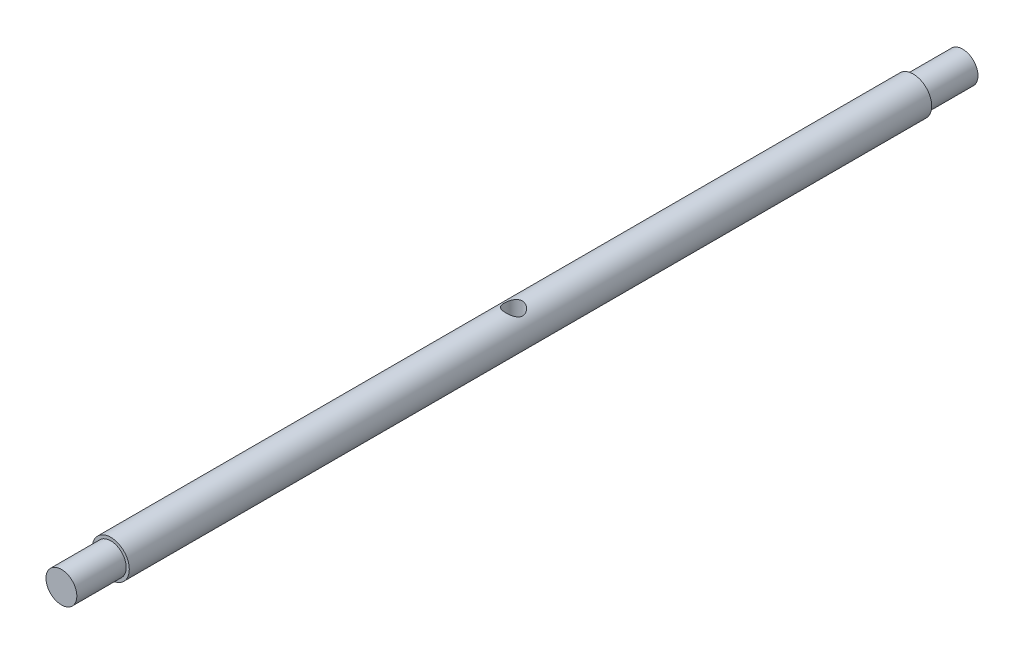
ISO-10303-21;
HEADER;
FILE_DESCRIPTION(('STEP AP214'),'2;1');
FILE_NAME('part.step','',(''),(''),'','','');
FILE_SCHEMA(('AUTOMOTIVE_DESIGN { 1 0 10303 214 1 1 1 1 }'));
ENDSEC;
DATA;
#1=APPLICATION_CONTEXT('core data for automotive mechanical design processes');
#2=APPLICATION_PROTOCOL_DEFINITION('international standard','automotive_design',2000,#1);
#3=PRODUCT_CONTEXT('',#1,'mechanical');
#4=PRODUCT('Part','Part','',(#3));
#5=PRODUCT_RELATED_PRODUCT_CATEGORY('part','',(#4));
#6=PRODUCT_DEFINITION_FORMATION('','',#4);
#7=PRODUCT_DEFINITION_CONTEXT('part definition',#1,'design');
#8=PRODUCT_DEFINITION('design','',#6,#7);
#9=PRODUCT_DEFINITION_SHAPE('','',#8);
#10=(LENGTH_UNIT() NAMED_UNIT(*) SI_UNIT(.MILLI.,.METRE.));
#11=(NAMED_UNIT(*) PLANE_ANGLE_UNIT() SI_UNIT($,.RADIAN.));
#12=(NAMED_UNIT(*) SI_UNIT($,.STERADIAN.) SOLID_ANGLE_UNIT());
#13=UNCERTAINTY_MEASURE_WITH_UNIT(LENGTH_MEASURE(1.E-05),#10,'distance_accuracy_value','');
#14=(GEOMETRIC_REPRESENTATION_CONTEXT(3) GLOBAL_UNCERTAINTY_ASSIGNED_CONTEXT((#13)) GLOBAL_UNIT_ASSIGNED_CONTEXT((#10,
#11,#12)) REPRESENTATION_CONTEXT('',''));
#15=CARTESIAN_POINT('',(0.,0.,0.));
#16=DIRECTION('',(0.,0.,1.));
#17=DIRECTION('',(1.,0.,0.));
#18=AXIS2_PLACEMENT_3D('',#15,#16,#17);
#19=CARTESIAN_POINT('',(0.,0.,130.));
#20=DIRECTION('',(0.,0.,-1.));
#21=DIRECTION('',(-1.,0.,0.));
#22=AXIS2_PLACEMENT_3D('',#19,#20,#21);
#23=CYLINDRICAL_SURFACE('',#22,3.);
#24=CARTESIAN_POINT('',(0.25,-2.98956518577535,66.5));
#25=CARTESIAN_POINT('',(0.17269642141614,-2.99602553013006,66.4999952113587));
#26=CARTESIAN_POINT('',(0.0950608738628822,-2.99947183506212,66.4939911977629));
#27=CARTESIAN_POINT('',(-0.0584400000249379,-3.00041641133484,66.4700060739507));
#28=CARTESIAN_POINT('',(-0.134302599700459,-2.99790606090529,66.4520076298905));
#29=CARTESIAN_POINT('',(-0.281790664814006,-2.98764875279408,66.4046990716207));
#30=CARTESIAN_POINT('',(-0.35342724917192,-2.9799162704619,66.37542032166));
#31=CARTESIAN_POINT('',(-0.49089667125681,-2.96037977583642,66.3065180067073));
#32=CARTESIAN_POINT('',(-0.556729410100019,-2.94857569418956,66.2668942655069));
#33=CARTESIAN_POINT('',(-0.68390290566241,-2.92175981715249,66.1765070165311));
#34=CARTESIAN_POINT('',(-0.744932006141061,-2.90663261458157,66.1253402270932));
#35=CARTESIAN_POINT('',(-0.858035984268782,-2.8752782830735,66.0141750538369));
#36=CARTESIAN_POINT('',(-0.910106018343036,-2.85905056572865,65.9541719251226));
#37=CARTESIAN_POINT('',(-1.00783823474594,-2.82614993688294,65.8216608362764));
#38=CARTESIAN_POINT('',(-1.05270403709698,-2.80953814266997,65.7485470746806));
#39=CARTESIAN_POINT('',(-1.12952233663047,-2.77954837023804,65.5952020399382));
#40=CARTESIAN_POINT('',(-1.16147822464401,-2.76616954324119,65.5149726424969));
#41=CARTESIAN_POINT('',(-1.21068231642024,-2.74498771769881,65.3514557226514));
#42=CARTESIAN_POINT('',(-1.22825565630192,-2.73706214215833,65.2682829052235));
#43=CARTESIAN_POINT('',(-1.24907437267902,-2.7276277771573,65.0998283727901));
#44=CARTESIAN_POINT('',(-1.25232969875111,-2.72611453180026,65.0145481636632));
#45=CARTESIAN_POINT('',(-1.2447045977589,-2.72960005759235,64.8519083751222));
#46=CARTESIAN_POINT('',(-1.23497697349754,-2.73406785294911,64.7744797801816));
#47=CARTESIAN_POINT('',(-1.20378978270818,-2.74794060264144,64.622486262657));
#48=CARTESIAN_POINT('',(-1.18232772499008,-2.75734660532886,64.5479219517519));
#49=CARTESIAN_POINT('',(-1.12815486514093,-2.77995148574605,64.4027028080583));
#50=CARTESIAN_POINT('',(-1.09532481225703,-2.79319031849184,64.3320990318549));
#51=CARTESIAN_POINT('',(-1.01939794960569,-2.82178498312674,64.1971104043154));
#52=CARTESIAN_POINT('',(-0.976296911856051,-2.83714168572323,64.1327281293993));
#53=CARTESIAN_POINT('',(-0.876645912761245,-2.86957547362445,64.0061689998989));
#54=CARTESIAN_POINT('',(-0.819257803193822,-2.8866868853803,63.9446586786066));
#55=CARTESIAN_POINT('',(-0.694725375416323,-2.91915973110964,63.8318594221669));
#56=CARTESIAN_POINT('',(-0.627579181744112,-2.9345208276652,63.7805724564089));
#57=CARTESIAN_POINT('',(-0.484002949245948,-2.96161231613355,63.6890512104587));
#58=CARTESIAN_POINT('',(-0.407452021459474,-2.97328661594214,63.6489886455506));
#59=CARTESIAN_POINT('',(-0.248041133960005,-2.99079996604019,63.5824674072718));
#60=CARTESIAN_POINT('',(-0.165185983640129,-2.9966434174961,63.5559984806601));
#61=CARTESIAN_POINT('',(-0.00277248739778299,-3.00100907113582,63.5192999209167));
#62=CARTESIAN_POINT('',(0.0765154336064436,-3.00008206449229,63.5079358686385));
#63=CARTESIAN_POINT('',(0.235543527844696,-2.99179737422256,63.4979568907608));
#64=CARTESIAN_POINT('',(0.315283582667204,-2.9844413034606,63.4993387684109));
#65=CARTESIAN_POINT('',(0.468809965625171,-2.96410572172022,63.5141405994697));
#66=CARTESIAN_POINT('',(0.542695567092175,-2.9514227687626,63.5269609495946));
#67=CARTESIAN_POINT('',(0.686813726089401,-2.92125182634506,63.5630878149209));
#68=CARTESIAN_POINT('',(0.757045549245624,-2.90376287532967,63.5863964291472));
#69=CARTESIAN_POINT('',(0.896335445624111,-2.86393578112953,63.6441757942527));
#70=CARTESIAN_POINT('',(0.965095372126569,-2.84137710821006,63.6792098821918));
#71=CARTESIAN_POINT('',(1.09580389853578,-2.79357579351915,63.7588390109646));
#72=CARTESIAN_POINT('',(1.15774910097523,-2.76833182522364,63.8034387883658));
#73=CARTESIAN_POINT('',(1.28073937979295,-2.71380534340435,63.9069453045832));
#74=CARTESIAN_POINT('',(1.34083682600192,-2.68439520112318,63.966914002283));
#75=CARTESIAN_POINT('',(1.45039802141764,-2.62682010616241,64.0965316127875));
#76=CARTESIAN_POINT('',(1.49985070609687,-2.59865647306368,64.1661904752879));
#77=CARTESIAN_POINT('',(1.58865105160203,-2.54538491275337,64.3173425485545));
#78=CARTESIAN_POINT('',(1.62746875980633,-2.52046198169207,64.3992174575315));
#79=CARTESIAN_POINT('',(1.69004794562851,-2.47894626080137,64.5704428848147));
#80=CARTESIAN_POINT('',(1.71384470769536,-2.46233396835001,64.6597753216171));
#81=CARTESIAN_POINT('',(1.74235772318642,-2.44222225416342,64.8292944683731));
#82=CARTESIAN_POINT('',(1.74935466727668,-2.43716097073707,64.9089091849373));
#83=CARTESIAN_POINT('',(1.7505585690523,-2.43629851234424,65.0682744895491));
#84=CARTESIAN_POINT('',(1.74477159394934,-2.44049294464035,65.1480249952013));
#85=CARTESIAN_POINT('',(1.72245945671945,-2.45627310709654,65.2942914902519));
#86=CARTESIAN_POINT('',(1.70745098558705,-2.46681119822039,65.3611658702209));
#87=CARTESIAN_POINT('',(1.66887874739995,-2.49306758410284,65.4913171316343));
#88=CARTESIAN_POINT('',(1.64531201334897,-2.5087876751933,65.5545927566452));
#89=CARTESIAN_POINT('',(1.58782565973682,-2.54559946080172,65.6823386299015));
#90=CARTESIAN_POINT('',(1.55313654939841,-2.56705903813716,65.7463537754109));
#91=CARTESIAN_POINT('',(1.47540709597102,-2.61250883856217,65.8681018728933));
#92=CARTESIAN_POINT('',(1.43236188557381,-2.6365005328387,65.9258311326879));
#93=CARTESIAN_POINT('',(1.33040732932634,-2.68958535448198,66.0439491556104));
#94=CARTESIAN_POINT('',(1.27003921802977,-2.71883295023782,66.1030166232692));
#95=CARTESIAN_POINT('',(1.13980707944065,-2.77595010505171,66.210527653715));
#96=CARTESIAN_POINT('',(1.06993446670592,-2.80381838676857,66.2589615065237));
#97=CARTESIAN_POINT('',(0.918383140458659,-2.8571538770292,66.3458277954573));
#98=CARTESIAN_POINT('',(0.836298835418434,-2.88244173980691,66.3836689017873));
#99=CARTESIAN_POINT('',(0.665254712903867,-2.92663196032698,66.4442085264027));
#100=CARTESIAN_POINT('',(0.576316164327066,-2.94555316541864,66.4669519367019));
#101=CARTESIAN_POINT('',(0.446784312400438,-2.96680680158529,66.4875563431324));
#102=CARTESIAN_POINT('',(0.407708195646956,-2.97243051578879,66.4922072442007));
#103=CARTESIAN_POINT('',(0.329117120645278,-2.98215498221843,66.4984304419079));
#104=CARTESIAN_POINT('',(0.289602122062034,-2.98625559325215,66.5000024531899));
#105=CARTESIAN_POINT('',(0.25,-2.98956518577535,66.5));
#106=B_SPLINE_CURVE_WITH_KNOTS('',3,(#24,#25,#26,#27,#28,#29,#30,#31,#32,#33,#34,#35,#36,#37,
#38,#39,#40,#41,#42,#43,#44,#45,#46,#47,#48,#49,#50,#51,#52,#53,#54,#55,#56,#57,#58,#59,#60,#61,
#62,#63,#64,#65,#66,#67,#68,#69,#70,#71,#72,#73,#74,#75,#76,#77,#78,#79,#80,#81,#82,#83,#84,#85,
#86,#87,#88,#89,#90,#91,#92,#93,#94,#95,#96,#97,#98,#99,#100,#101,#102,#103,#104,#105),
.UNSPECIFIED.,.T.,.F.,(4,2,2,2,2,2,2,2,2,2,2,2,2,2,2,2,2,2,2,2,2,2,2,2,2,2,2,2,2,2,2,2,2,2,2,2,
2,2,2,2,4),(0.,0.232563482252474,0.465463786363049,0.697721144104779,0.929982458196799,
1.17215711436666,1.41446228974798,1.67532828554851,1.93612571942891,2.19085060553646,
2.44539845552473,2.67878211225922,2.91221533499409,3.14817542976346,3.38423282422607,
3.64060352104624,3.89702355654567,4.15717534424428,4.41713061861898,4.65618810668928,
4.89518563943392,5.12234626549699,5.34955237363677,5.58978476628075,5.83013638868451,
6.09852077395966,6.36718279420662,6.64747203003739,6.92710038738122,7.16585255100742,
7.40449142788037,7.61166075227992,7.81890196724106,8.04578374806322,8.2727980829704,
8.53978167468719,8.80700805505604,9.08705528583567,9.36626603941853,9.48539576277475,
9.60453652676077),.UNSPECIFIED.);
#107=CARTESIAN_POINT('',(0.25,-2.98956518577535,66.5));
#108=VERTEX_POINT('',#107);
#109=EDGE_CURVE('E56',#108,#108,#106,.T.);
#110=ORIENTED_EDGE('',*,*,#109,.F.);
#111=EDGE_LOOP('',(#110));
#112=FACE_BOUND('',#111,.T.);
#113=CARTESIAN_POINT('',(0.25,2.98956518577535,63.5));
#114=CARTESIAN_POINT('',(0.33073873193991,2.98280873811263,63.5000051662356));
#115=CARTESIAN_POINT('',(0.411273292725283,2.97274996540562,63.5065552512323));
#116=CARTESIAN_POINT('',(0.569364602132381,2.94657004716183,63.5321971590116));
#117=CARTESIAN_POINT('',(0.646916073100532,2.93043865687144,63.5513102169239));
#118=CARTESIAN_POINT('',(0.796593237901086,2.89332996682384,63.6009204263813));
#119=CARTESIAN_POINT('',(0.868742659202936,2.87237573475027,63.6313637995732));
#120=CARTESIAN_POINT('',(1.00658134407404,2.82702422335257,63.7024621840947));
#121=CARTESIAN_POINT('',(1.07227095362022,2.80262712859312,63.7431166481201));
#122=CARTESIAN_POINT('',(1.20120103979433,2.7499716923404,63.8372066612413));
#123=CARTESIAN_POINT('',(1.26382108021966,2.72156060827127,63.8914064831905));
#124=CARTESIAN_POINT('',(1.37942528956076,2.66483416649005,64.0094282026102));
#125=CARTESIAN_POINT('',(1.43239790902895,2.63651896282652,64.0732614678589));
#126=CARTESIAN_POINT('',(1.53120069682797,2.58048211432322,64.2148032164578));
#127=CARTESIAN_POINT('',(1.57617536367075,2.55297129204232,64.2931993416078));
#128=CARTESIAN_POINT('',(1.6517779151933,2.5047275467081,64.4584933708717));
#129=CARTESIAN_POINT('',(1.68243734716646,2.48397975036853,64.5453720652794));
#130=CARTESIAN_POINT('',(1.72174861813425,2.45682658701134,64.7021291054429));
#131=CARTESIAN_POINT('',(1.73401559820486,2.44811489530238,64.7707067672343));
#132=CARTESIAN_POINT('',(1.74888071332913,2.43752050568492,64.909403229629));
#133=CARTESIAN_POINT('',(1.75148729222158,2.43563184402684,64.9795206304379));
#134=CARTESIAN_POINT('',(1.74688577272881,2.43893335683976,65.119266842837));
#135=CARTESIAN_POINT('',(1.7396755968006,2.44412502973906,65.1888955478684));
#136=CARTESIAN_POINT('',(1.71585333459778,2.46090502069016,65.3257390265998));
#137=CARTESIAN_POINT('',(1.69923463680864,2.47249783678318,65.3929520674146));
#138=CARTESIAN_POINT('',(1.65694278227622,2.50103945031691,65.5247911771604));
#139=CARTESIAN_POINT('',(1.63109253895183,2.51809227237098,65.5893369505944));
#140=CARTESIAN_POINT('',(1.57129421057681,2.55583314179351,65.7133932059918));
#141=CARTESIAN_POINT('',(1.53734288927566,2.57652264108404,65.7729016627242));
#142=CARTESIAN_POINT('',(1.45567270494108,2.62366110115277,65.8959326147669));
#143=CARTESIAN_POINT('',(1.40659318649114,2.65049044505073,65.9584076190438));
#144=CARTESIAN_POINT('',(1.29933931469122,2.70468735899781,66.0747824386444));
#145=CARTESIAN_POINT('',(1.24115734840791,2.73205536265852,66.1286749991158));
#146=CARTESIAN_POINT('',(1.10913117162798,2.78847062300486,66.2327907777924));
#147=CARTESIAN_POINT('',(1.03424662886944,2.81732896954532,66.2818101375814));
#148=CARTESIAN_POINT('',(0.875688959705423,2.87056572531939,66.3662234058533));
#149=CARTESIAN_POINT('',(0.792019766041947,2.89494612592806,66.4016233786808));
#150=CARTESIAN_POINT('',(0.622891488127767,2.9358386339939,66.4554666168759));
#151=CARTESIAN_POINT('',(0.53778589780697,2.9527106651175,66.4747377297906));
#152=CARTESIAN_POINT('',(0.364426251595457,2.9790692771816,66.4981775772863));
#153=CARTESIAN_POINT('',(0.276175278819307,2.98856289297778,66.5023607111999));
#154=CARTESIAN_POINT('',(0.110050078028703,2.99900165819639,66.495497946609));
#155=CARTESIAN_POINT('',(0.0321543832226321,3.00080735406335,66.4861548512244));
#156=CARTESIAN_POINT('',(-0.121135062623023,2.99853281299341,66.4554606504517));
#157=CARTESIAN_POINT('',(-0.196528994304623,2.99445300197495,66.4341104140565));
#158=CARTESIAN_POINT('',(-0.340873315112741,2.98143199574489,66.3808140615142));
#159=CARTESIAN_POINT('',(-0.409936381649034,2.97261247461647,66.3491406388397));
#160=CARTESIAN_POINT('',(-0.54208361019926,2.95137756068305,66.2760522960405));
#161=CARTESIAN_POINT('',(-0.605166244441455,2.9389612523043,66.23463489606));
#162=CARTESIAN_POINT('',(-0.728422524306809,2.91095845299777,66.1398085132658));
#163=CARTESIAN_POINT('',(-0.788059430869031,2.89520804378708,66.0857507078724));
#164=CARTESIAN_POINT('',(-0.89789492290758,2.86305192996224,65.9689034161992));
#165=CARTESIAN_POINT('',(-0.948088011807043,2.84664585042185,65.9061088816428));
#166=CARTESIAN_POINT('',(-1.04102388370384,2.8140471270346,65.7685109503411));
#167=CARTESIAN_POINT('',(-1.08302247455212,2.79794579779126,65.693179992785));
#168=CARTESIAN_POINT('',(-1.15367768237463,2.76956463315533,65.5358327242646));
#169=CARTESIAN_POINT('',(-1.18234049832158,2.75728302309472,65.4538195403278));
#170=CARTESIAN_POINT('',(-1.22434879969597,2.73888353519597,65.2885875442407));
#171=CARTESIAN_POINT('',(-1.23822955223249,2.73255132087997,65.2055299310377));
#172=CARTESIAN_POINT('',(-1.25186610280975,2.72633351220779,65.0380434316593));
#173=CARTESIAN_POINT('',(-1.25162976303293,2.72644432955577,64.9536153349364));
#174=CARTESIAN_POINT('',(-1.23764609710901,2.73281458905837,64.7928654503927));
#175=CARTESIAN_POINT('',(-1.22496239496645,2.7385899734817,64.7164281765176));
#176=CARTESIAN_POINT('',(-1.18816946486268,2.75475096239939,64.5668691175421));
#177=CARTESIAN_POINT('',(-1.1640574236021,2.76513770202517,64.4937481536725));
#178=CARTESIAN_POINT('',(-1.10444840068186,2.78948935033095,64.3506655602011));
#179=CARTESIAN_POINT('',(-1.06867040861753,2.80354066026258,64.2808363990064));
#180=CARTESIAN_POINT('',(-0.986898302713424,2.83335895481494,64.1478365931592));
#181=CARTESIAN_POINT('',(-0.94089999920008,2.84912664168433,64.0846686949032));
#182=CARTESIAN_POINT('',(-0.835355749465324,2.88192342599577,63.9611811177354));
#183=CARTESIAN_POINT('',(-0.774992466602831,2.89894628349528,63.9015554957815));
#184=CARTESIAN_POINT('',(-0.644685058842952,2.9306776945024,63.7930512196244));
#185=CARTESIAN_POINT('',(-0.574737960002677,2.94538552658104,63.7441759136528));
#186=CARTESIAN_POINT('',(-0.426930293285246,2.97041202822187,63.6587117558716));
#187=CARTESIAN_POINT('',(-0.349067811586618,2.98072963315061,63.6221258847118));
#188=CARTESIAN_POINT('',(-0.187801808480512,2.99520302769709,63.5627539557));
#189=CARTESIAN_POINT('',(-0.104410510885697,2.9993719661473,63.5399385119448));
#190=CARTESIAN_POINT('',(0.0247816311580025,3.00023114010758,63.5163096582267));
#191=CARTESIAN_POINT('',(0.0696638823083672,2.99952965823438,63.5101933628879));
#192=CARTESIAN_POINT('',(0.159718676698938,2.99608404194846,63.5020372014414));
#193=CARTESIAN_POINT('',(0.204891204016306,2.99334001864514,63.4999971136199));
#194=CARTESIAN_POINT('',(0.25,2.98956518577535,63.5));
#195=B_SPLINE_CURVE_WITH_KNOTS('',3,(#113,#114,#115,#116,#117,#118,#119,#120,#121,#122,#123,
#124,#125,#126,#127,#128,#129,#130,#131,#132,#133,#134,#135,#136,#137,#138,#139,#140,#141,#142,
#143,#144,#145,#146,#147,#148,#149,#150,#151,#152,#153,#154,#155,#156,#157,#158,#159,#160,#161,
#162,#163,#164,#165,#166,#167,#168,#169,#170,#171,#172,#173,#174,#175,#176,#177,#178,#179,#180,
#181,#182,#183,#184,#185,#186,#187,#188,#189,#190,#191,#192,#193,#194),.UNSPECIFIED.,.T.,.F.,(4,
2,2,2,2,2,2,2,2,2,2,2,2,2,2,2,2,2,2,2,2,2,2,2,2,2,2,2,2,2,2,2,2,2,2,2,2,2,2,2,4),(0.,
0.2428779737016,0.486167542199706,0.72831678658504,0.970453054782751,1.23203655913491,
1.49393118970865,1.77584521095731,2.05713499536852,2.26683531092132,2.47635229104262,
2.68591361862991,2.89562239133208,3.10959149213279,3.32364621368352,3.57422301276412,
3.82501051607537,4.10570301491015,4.38627038391229,4.65135683207306,4.91619022583504,
5.15044178851435,5.38467639988305,5.61316665133948,5.84171511691008,6.08672424544618,
6.33187553825884,6.59379106702208,6.85558472560083,7.10753777046698,7.35935049732121,
7.59136701951383,7.82344068659956,8.06157809609157,8.29981330738311,8.55822072067225,
8.81670850244188,9.075258932022,9.33325564957961,9.46895915478713,9.60465527858546),.UNSPECIFIED.);
#196=CARTESIAN_POINT('',(0.25,2.98956518577535,63.5));
#197=VERTEX_POINT('',#196);
#198=EDGE_CURVE('E63',#197,#197,#195,.T.);
#199=ORIENTED_EDGE('',*,*,#198,.T.);
#200=EDGE_LOOP('',(#199));
#201=FACE_BOUND('',#200,.T.);
#202=CARTESIAN_POINT('',(0.,0.,130.));
#203=DIRECTION('',(0.,0.,1.));
#204=DIRECTION('',(1.,0.,0.));
#205=AXIS2_PLACEMENT_3D('',#202,#203,#204);
#206=CIRCLE('',#205,3.);
#207=CARTESIAN_POINT('',(3.,0.,130.));
#208=VERTEX_POINT('',#207);
#209=EDGE_CURVE('E37',#208,#208,#206,.T.);
#210=ORIENTED_EDGE('',*,*,#209,.F.);
#211=EDGE_LOOP('',(#210));
#212=FACE_BOUND('',#211,.T.);
#213=CARTESIAN_POINT('',(0.,0.,0.));
#214=DIRECTION('',(0.,0.,1.));
#215=DIRECTION('',(1.,0.,0.));
#216=AXIS2_PLACEMENT_3D('',#213,#214,#215);
#217=CIRCLE('',#216,3.);
#218=CARTESIAN_POINT('',(3.,0.,0.));
#219=VERTEX_POINT('',#218);
#220=EDGE_CURVE('E41',#219,#219,#217,.T.);
#221=ORIENTED_EDGE('',*,*,#220,.T.);
#222=EDGE_LOOP('',(#221));
#223=FACE_BOUND('',#222,.T.);
#224=ADVANCED_FACE('F31',(#112,#201,#212,#223),#23,.T.);
#225=CARTESIAN_POINT('',(0.,0.,130.));
#226=DIRECTION('',(0.,0.,1.));
#227=DIRECTION('',(1.,0.,0.));
#228=AXIS2_PLACEMENT_3D('',#225,#226,#227);
#229=PLANE('',#228);
#230=CARTESIAN_POINT('',(0.,0.,130.));
#231=DIRECTION('',(0.,0.,1.));
#232=DIRECTION('',(1.,0.,0.));
#233=AXIS2_PLACEMENT_3D('',#230,#231,#232);
#234=CIRCLE('',#233,2.5);
#235=CARTESIAN_POINT('',(2.5,0.,130.));
#236=VERTEX_POINT('',#235);
#237=EDGE_CURVE('E48',#236,#236,#234,.T.);
#238=ORIENTED_EDGE('',*,*,#237,.F.);
#239=EDGE_LOOP('',(#238));
#240=FACE_BOUND('',#239,.T.);
#241=ORIENTED_EDGE('',*,*,#209,.T.);
#242=EDGE_LOOP('',(#241));
#243=FACE_BOUND('',#242,.T.);
#244=ADVANCED_FACE('F89',(#240,#243),#229,.T.);
#245=CARTESIAN_POINT('',(0.,0.,0.));
#246=DIRECTION('',(0.,0.,1.));
#247=DIRECTION('',(1.,0.,0.));
#248=AXIS2_PLACEMENT_3D('',#245,#246,#247);
#249=PLANE('',#248);
#250=CARTESIAN_POINT('',(0.,0.,0.));
#251=DIRECTION('',(0.,0.,1.));
#252=DIRECTION('',(1.,0.,0.));
#253=AXIS2_PLACEMENT_3D('',#250,#251,#252);
#254=CIRCLE('',#253,2.5);
#255=CARTESIAN_POINT('',(2.5,0.,0.));
#256=VERTEX_POINT('',#255);
#257=EDGE_CURVE('E10',#256,#256,#254,.F.);
#258=ORIENTED_EDGE('',*,*,#257,.F.);
#259=EDGE_LOOP('',(#258));
#260=FACE_BOUND('',#259,.T.);
#261=ORIENTED_EDGE('',*,*,#220,.F.);
#262=EDGE_LOOP('',(#261));
#263=FACE_BOUND('',#262,.T.);
#264=ADVANCED_FACE('F87',(#260,#263),#249,.F.);
#265=CARTESIAN_POINT('',(0.,0.,138.));
#266=DIRECTION('',(0.,0.,-1.));
#267=DIRECTION('',(-1.,0.,0.));
#268=AXIS2_PLACEMENT_3D('',#265,#266,#267);
#269=CYLINDRICAL_SURFACE('',#268,2.5);
#270=CARTESIAN_POINT('',(0.,0.,138.));
#271=DIRECTION('',(0.,0.,1.));
#272=DIRECTION('',(1.,0.,0.));
#273=AXIS2_PLACEMENT_3D('',#270,#271,#272);
#274=CIRCLE('',#273,2.5);
#275=CARTESIAN_POINT('',(2.5,0.,138.));
#276=VERTEX_POINT('',#275);
#277=EDGE_CURVE('E46',#276,#276,#274,.T.);
#278=ORIENTED_EDGE('',*,*,#277,.F.);
#279=EDGE_LOOP('',(#278));
#280=FACE_BOUND('',#279,.T.);
#281=ORIENTED_EDGE('',*,*,#237,.T.);
#282=EDGE_LOOP('',(#281));
#283=FACE_BOUND('',#282,.T.);
#284=ADVANCED_FACE('F83',(#280,#283),#269,.T.);
#285=CARTESIAN_POINT('',(0.,0.,138.));
#286=DIRECTION('',(0.,0.,1.));
#287=DIRECTION('',(1.,0.,0.));
#288=AXIS2_PLACEMENT_3D('',#285,#286,#287);
#289=PLANE('',#288);
#290=ORIENTED_EDGE('',*,*,#277,.T.);
#291=EDGE_LOOP('',(#290));
#292=FACE_BOUND('',#291,.T.);
#293=ADVANCED_FACE('F79',(#292),#289,.T.);
#294=CARTESIAN_POINT('',(0.,0.,-8.));
#295=DIRECTION('',(0.,0.,1.));
#296=DIRECTION('',(1.,0.,0.));
#297=AXIS2_PLACEMENT_3D('',#294,#295,#296);
#298=CYLINDRICAL_SURFACE('',#297,2.5);
#299=CARTESIAN_POINT('',(0.,0.,-8.));
#300=DIRECTION('',(0.,0.,-1.));
#301=DIRECTION('',(-1.,0.,0.));
#302=AXIS2_PLACEMENT_3D('',#299,#300,#301);
#303=CIRCLE('',#302,2.5);
#304=CARTESIAN_POINT('',(-2.5,0.,-8.));
#305=VERTEX_POINT('',#304);
#306=EDGE_CURVE('E51',#305,#305,#303,.T.);
#307=ORIENTED_EDGE('',*,*,#306,.F.);
#308=EDGE_LOOP('',(#307));
#309=FACE_BOUND('',#308,.T.);
#310=ORIENTED_EDGE('',*,*,#257,.T.);
#311=EDGE_LOOP('',(#310));
#312=FACE_BOUND('',#311,.T.);
#313=ADVANCED_FACE('F75',(#309,#312),#298,.T.);
#314=CARTESIAN_POINT('',(0.,0.,-8.));
#315=DIRECTION('',(0.,0.,-1.));
#316=DIRECTION('',(-1.,0.,0.));
#317=AXIS2_PLACEMENT_3D('',#314,#315,#316);
#318=PLANE('',#317);
#319=ORIENTED_EDGE('',*,*,#306,.T.);
#320=EDGE_LOOP('',(#319));
#321=FACE_BOUND('',#320,.T.);
#322=ADVANCED_FACE('F72',(#321),#318,.T.);
#323=CARTESIAN_POINT('',(0.25,-3.001,65.));
#324=DIRECTION('',(0.,1.,0.));
#325=DIRECTION('',(0.,0.,1.));
#326=AXIS2_PLACEMENT_3D('',#323,#324,#325);
#327=CYLINDRICAL_SURFACE('',#326,1.5);
#328=ORIENTED_EDGE('',*,*,#109,.T.);
#329=EDGE_LOOP('',(#328));
#330=FACE_BOUND('',#329,.T.);
#331=ORIENTED_EDGE('',*,*,#198,.F.);
#332=EDGE_LOOP('',(#331));
#333=FACE_BOUND('',#332,.T.);
#334=ADVANCED_FACE('F68',(#330,#333),#327,.F.);
#335=CLOSED_SHELL('',(#224,#244,#264,#284,#293,#313,#322,#334));
#336=MANIFOLD_SOLID_BREP('B2',#335);
#337=ADVANCED_BREP_SHAPE_REPRESENTATION('',(#18,#336),#14);
#338=SHAPE_DEFINITION_REPRESENTATION(#9,#337);
ENDSEC;
END-ISO-10303-21;
